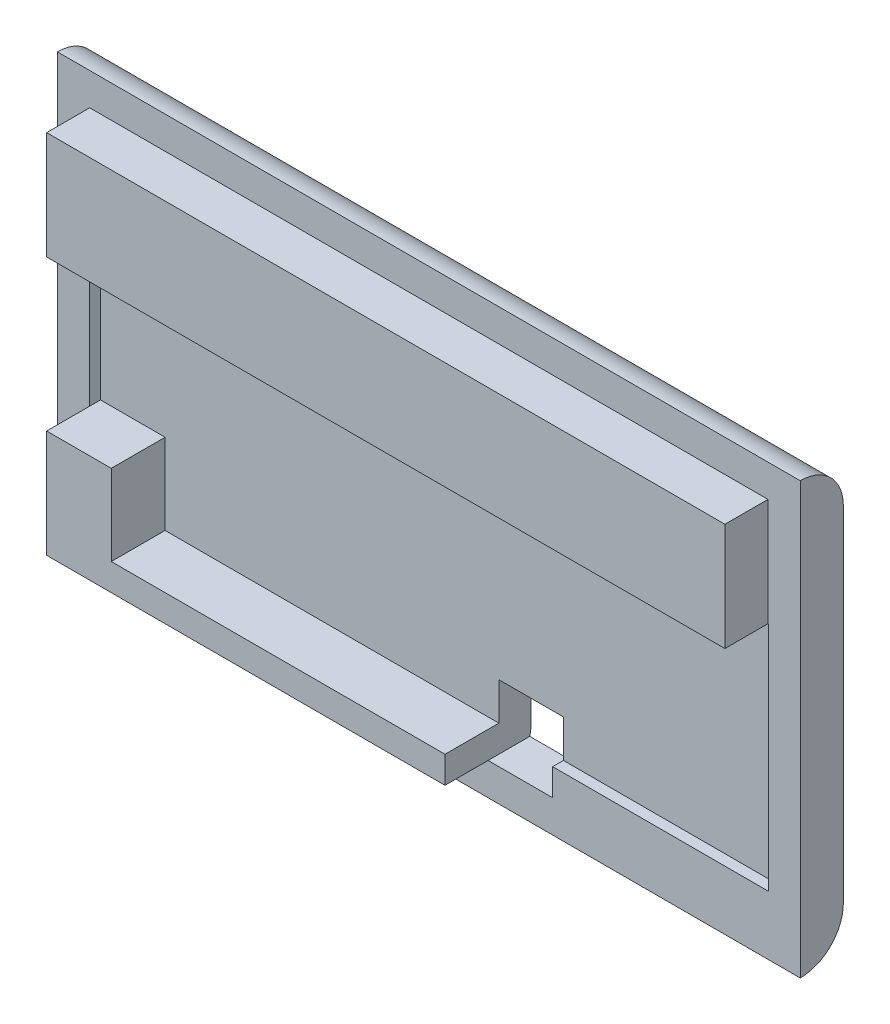
ISO-10303-21;
HEADER;
FILE_DESCRIPTION(('STEP AP214'),'2;1');
FILE_NAME('part.step','',(''),(''),'','','');
FILE_SCHEMA(('AUTOMOTIVE_DESIGN { 1 0 10303 214 1 1 1 1 }'));
ENDSEC;
DATA;
#1=APPLICATION_CONTEXT('core data for automotive mechanical design processes');
#2=APPLICATION_PROTOCOL_DEFINITION('international standard','automotive_design',2000,#1);
#3=PRODUCT_CONTEXT('',#1,'mechanical');
#4=PRODUCT('Part','Part','',(#3));
#5=PRODUCT_RELATED_PRODUCT_CATEGORY('part','',(#4));
#6=PRODUCT_DEFINITION_FORMATION('','',#4);
#7=PRODUCT_DEFINITION_CONTEXT('part definition',#1,'design');
#8=PRODUCT_DEFINITION('design','',#6,#7);
#9=PRODUCT_DEFINITION_SHAPE('','',#8);
#10=(LENGTH_UNIT() NAMED_UNIT(*) SI_UNIT(.MILLI.,.METRE.));
#11=(NAMED_UNIT(*) PLANE_ANGLE_UNIT() SI_UNIT($,.RADIAN.));
#12=(NAMED_UNIT(*) SI_UNIT($,.STERADIAN.) SOLID_ANGLE_UNIT());
#13=UNCERTAINTY_MEASURE_WITH_UNIT(LENGTH_MEASURE(1.E-05),#10,'distance_accuracy_value','');
#14=(GEOMETRIC_REPRESENTATION_CONTEXT(3) GLOBAL_UNCERTAINTY_ASSIGNED_CONTEXT((#13)) GLOBAL_UNIT_ASSIGNED_CONTEXT((#10,
#11,#12)) REPRESENTATION_CONTEXT('',''));
#15=CARTESIAN_POINT('',(0.,0.,0.));
#16=DIRECTION('',(0.,0.,1.));
#17=DIRECTION('',(1.,0.,0.));
#18=AXIS2_PLACEMENT_3D('',#15,#16,#17);
#19=CARTESIAN_POINT('',(5.75,-5.5,10.));
#20=DIRECTION('',(0.,1.,0.));
#21=DIRECTION('',(0.,0.,1.));
#22=AXIS2_PLACEMENT_3D('',#19,#20,#21);
#23=PLANE('',#22);
#24=DIRECTION('',(1.,0.,0.));
#25=VECTOR('',#24,1.);
#26=CARTESIAN_POINT('',(5.75,-5.5,1.5));
#27=LINE('',#26,#25);
#28=CARTESIAN_POINT('',(2.75,-5.5,1.5));
#29=VERTEX_POINT('',#28);
#30=CARTESIAN_POINT('',(5.75,-5.5,1.5));
#31=VERTEX_POINT('',#30);
#32=EDGE_CURVE('E248',#29,#31,#27,.T.);
#33=ORIENTED_EDGE('',*,*,#32,.F.);
#34=DIRECTION('',(0.,0.,-1.));
#35=VECTOR('',#34,1.);
#36=CARTESIAN_POINT('',(2.75,-5.5,10.));
#37=LINE('',#36,#35);
#38=CARTESIAN_POINT('',(2.75,-5.5,0.));
#39=VERTEX_POINT('',#38);
#40=EDGE_CURVE('E296',#29,#39,#37,.T.);
#41=ORIENTED_EDGE('',*,*,#40,.T.);
#42=DIRECTION('',(1.,0.,0.));
#43=VECTOR('',#42,1.);
#44=CARTESIAN_POINT('',(5.75,-5.5,0.));
#45=LINE('',#44,#43);
#46=CARTESIAN_POINT('',(5.75,-5.5,0.));
#47=VERTEX_POINT('',#46);
#48=EDGE_CURVE('E289',#39,#47,#45,.T.);
#49=ORIENTED_EDGE('',*,*,#48,.T.);
#50=DIRECTION('',(0.,0.,-1.));
#51=VECTOR('',#50,1.);
#52=CARTESIAN_POINT('',(5.75,-5.5,10.));
#53=LINE('',#52,#51);
#54=EDGE_CURVE('E304',#31,#47,#53,.T.);
#55=ORIENTED_EDGE('',*,*,#54,.F.);
#56=EDGE_LOOP('',(#33,#41,#49,#55));
#57=FACE_BOUND('',#56,.T.);
#58=ADVANCED_FACE('F44',(#57),#23,.F.);
#59=CARTESIAN_POINT('',(5.75,-8.5,10.));
#60=DIRECTION('',(1.,0.,0.));
#61=DIRECTION('',(0.,1.,0.));
#62=AXIS2_PLACEMENT_3D('',#59,#60,#61);
#63=PLANE('',#62);
#64=DIRECTION('',(0.,-1.,0.));
#65=VECTOR('',#64,1.);
#66=CARTESIAN_POINT('',(5.75,-8.5,2.));
#67=LINE('',#66,#65);
#68=CARTESIAN_POINT('',(5.75,-7.25,2.));
#69=VERTEX_POINT('',#68);
#70=CARTESIAN_POINT('',(5.75,-8.5,2.));
#71=VERTEX_POINT('',#70);
#72=EDGE_CURVE('E278',#69,#71,#67,.T.);
#73=ORIENTED_EDGE('',*,*,#72,.F.);
#74=DIRECTION('',(0.,0.,-1.));
#75=VECTOR('',#74,1.);
#76=CARTESIAN_POINT('',(5.75,-7.25,10.));
#77=LINE('',#76,#75);
#78=CARTESIAN_POINT('',(5.74999999999999,-7.25,1.5));
#79=VERTEX_POINT('',#78);
#80=EDGE_CURVE('E268',#69,#79,#77,.T.);
#81=ORIENTED_EDGE('',*,*,#80,.T.);
#82=DIRECTION('',(0.,-1.,0.));
#83=VECTOR('',#82,1.);
#84=CARTESIAN_POINT('',(5.75,-8.5,1.5));
#85=LINE('',#84,#83);
#86=EDGE_CURVE('E262',#31,#79,#85,.T.);
#87=ORIENTED_EDGE('',*,*,#86,.F.);
#88=ORIENTED_EDGE('',*,*,#54,.T.);
#89=DIRECTION('',(0.,-1.,0.));
#90=VECTOR('',#89,1.);
#91=CARTESIAN_POINT('',(5.75,-8.5,0.));
#92=LINE('',#91,#90);
#93=CARTESIAN_POINT('',(5.75,-8.,0.));
#94=VERTEX_POINT('',#93);
#95=EDGE_CURVE('E293',#47,#94,#92,.T.);
#96=ORIENTED_EDGE('',*,*,#95,.T.);
#97=CARTESIAN_POINT('',(5.75,-8.,2.));
#98=DIRECTION('',(1.,0.,0.));
#99=DIRECTION('',(0.,1.,0.));
#100=AXIS2_PLACEMENT_3D('',#97,#98,#99);
#101=CIRCLE('',#100,2.);
#102=CARTESIAN_POINT('',(5.75,-8.5,0.0635083268962899));
#103=VERTEX_POINT('',#102);
#104=EDGE_CURVE('E68',#94,#103,#101,.F.);
#105=ORIENTED_EDGE('',*,*,#104,.T.);
#106=DIRECTION('',(0.,0.,-1.));
#107=VECTOR('',#106,1.);
#108=CARTESIAN_POINT('',(5.75,-8.5,10.));
#109=LINE('',#108,#107);
#110=EDGE_CURVE('E301',#71,#103,#109,.T.);
#111=ORIENTED_EDGE('',*,*,#110,.F.);
#112=EDGE_LOOP('',(#73,#81,#87,#88,#96,#105,#111));
#113=FACE_BOUND('',#112,.T.);
#114=ADVANCED_FACE('F510',(#113),#63,.F.);
#115=CARTESIAN_POINT('',(-15.75,-8.5,4.));
#116=DIRECTION('',(0.,1.,0.));
#117=DIRECTION('',(0.,0.,1.));
#118=AXIS2_PLACEMENT_3D('',#115,#116,#117);
#119=PLANE('',#118);
#120=DIRECTION('',(1.,0.,0.));
#121=VECTOR('',#120,1.);
#122=CARTESIAN_POINT('',(-15.75,-8.5,2.));
#123=LINE('',#122,#121);
#124=CARTESIAN_POINT('',(-15.75,-8.5,2.));
#125=VERTEX_POINT('',#124);
#126=CARTESIAN_POINT('',(2.75,-8.5,2.));
#127=VERTEX_POINT('',#126);
#128=EDGE_CURVE('E361',#125,#127,#123,.T.);
#129=ORIENTED_EDGE('',*,*,#128,.T.);
#130=DIRECTION('',(0.,0.,-1.));
#131=VECTOR('',#130,1.);
#132=CARTESIAN_POINT('',(2.75,-8.5,10.));
#133=LINE('',#132,#131);
#134=CARTESIAN_POINT('',(2.75,-8.5,4.));
#135=VERTEX_POINT('',#134);
#136=EDGE_CURVE('E300',#135,#127,#133,.T.);
#137=ORIENTED_EDGE('',*,*,#136,.F.);
#138=DIRECTION('',(1.,0.,0.));
#139=VECTOR('',#138,1.);
#140=CARTESIAN_POINT('',(-15.75,-8.5,4.));
#141=LINE('',#140,#139);
#142=CARTESIAN_POINT('',(-15.75,-8.5,4.));
#143=VERTEX_POINT('',#142);
#144=EDGE_CURVE('E360',#143,#135,#141,.T.);
#145=ORIENTED_EDGE('',*,*,#144,.F.);
#146=DIRECTION('',(0.,0.,-1.));
#147=VECTOR('',#146,1.);
#148=CARTESIAN_POINT('',(-15.75,-8.5,4.));
#149=LINE('',#148,#147);
#150=EDGE_CURVE('E357',#143,#125,#149,.T.);
#151=ORIENTED_EDGE('',*,*,#150,.T.);
#152=EDGE_LOOP('',(#129,#137,#145,#151));
#153=FACE_BOUND('',#152,.T.);
#154=ADVANCED_FACE('F452',(#153),#119,.F.);
#155=CARTESIAN_POINT('',(0.,0.,2.));
#156=DIRECTION('',(0.,0.,1.));
#157=DIRECTION('',(1.,0.,0.));
#158=AXIS2_PLACEMENT_3D('',#155,#156,#157);
#159=PLANE('',#158);
#160=DIRECTION('',(0.,-1.,0.));
#161=VECTOR('',#160,1.);
#162=CARTESIAN_POINT('',(-15.75,0.,2.));
#163=LINE('',#162,#161);
#164=CARTESIAN_POINT('',(-15.75,3.5,2.));
#165=VERTEX_POINT('',#164);
#166=CARTESIAN_POINT('',(-15.75,-3.5,2.));
#167=VERTEX_POINT('',#166);
#168=EDGE_CURVE('E205',#165,#167,#163,.T.);
#169=ORIENTED_EDGE('',*,*,#168,.F.);
#170=DIRECTION('',(0.,-1.,0.));
#171=VECTOR('',#170,1.);
#172=CARTESIAN_POINT('',(-15.75,8.5,2.));
#173=LINE('',#172,#171);
#174=CARTESIAN_POINT('',(-15.75,8.5,2.));
#175=VERTEX_POINT('',#174);
#176=EDGE_CURVE('E333',#175,#165,#173,.T.);
#177=ORIENTED_EDGE('',*,*,#176,.F.);
#178=DIRECTION('',(-1.,0.,0.));
#179=VECTOR('',#178,1.);
#180=CARTESIAN_POINT('',(-15.75,8.5,2.));
#181=LINE('',#180,#179);
#182=CARTESIAN_POINT('',(15.75,8.5,2.));
#183=VERTEX_POINT('',#182);
#184=EDGE_CURVE('E329',#183,#175,#181,.T.);
#185=ORIENTED_EDGE('',*,*,#184,.F.);
#186=DIRECTION('',(0.,1.,0.));
#187=VECTOR('',#186,1.);
#188=CARTESIAN_POINT('',(15.75,8.5,2.));
#189=LINE('',#188,#187);
#190=CARTESIAN_POINT('',(15.75,3.5,2.));
#191=VERTEX_POINT('',#190);
#192=EDGE_CURVE('E319',#191,#183,#189,.T.);
#193=ORIENTED_EDGE('',*,*,#192,.F.);
#194=DIRECTION('',(-1.,0.,0.));
#195=VECTOR('',#194,1.);
#196=CARTESIAN_POINT('',(0.,3.5,2.));
#197=LINE('',#196,#195);
#198=CARTESIAN_POINT('',(15.7628865621832,3.5,2.));
#199=VERTEX_POINT('',#198);
#200=EDGE_CURVE('E272',#199,#191,#197,.T.);
#201=ORIENTED_EDGE('',*,*,#200,.F.);
#202=DIRECTION('',(0.,1.,0.));
#203=VECTOR('',#202,1.);
#204=CARTESIAN_POINT('',(15.7628865621832,0.,2.));
#205=LINE('',#204,#203);
#206=CARTESIAN_POINT('',(15.7628865621832,-7.25,2.));
#207=VERTEX_POINT('',#206);
#208=EDGE_CURVE('E11',#207,#199,#205,.T.);
#209=ORIENTED_EDGE('',*,*,#208,.F.);
#210=DIRECTION('',(1.,0.,0.));
#211=VECTOR('',#210,1.);
#212=CARTESIAN_POINT('',(0.,-7.25,2.));
#213=LINE('',#212,#211);
#214=EDGE_CURVE('E265',#69,#207,#213,.T.);
#215=ORIENTED_EDGE('',*,*,#214,.F.);
#216=ORIENTED_EDGE('',*,*,#72,.T.);
#217=DIRECTION('',(1.,0.,0.));
#218=VECTOR('',#217,1.);
#219=CARTESIAN_POINT('',(0.,-8.5,2.));
#220=LINE('',#219,#218);
#221=EDGE_CURVE('E309',#127,#71,#220,.T.);
#222=ORIENTED_EDGE('',*,*,#221,.F.);
#223=ORIENTED_EDGE('',*,*,#128,.F.);
#224=DIRECTION('',(0.,-1.,0.));
#225=VECTOR('',#224,1.);
#226=CARTESIAN_POINT('',(-15.75,-8.5,2.));
#227=LINE('',#226,#225);
#228=EDGE_CURVE('E334',#167,#125,#227,.T.);
#229=ORIENTED_EDGE('',*,*,#228,.F.);
#230=EDGE_LOOP('',(#169,#177,#185,#193,#201,#209,#215,#216,#222,#223,#229));
#231=FACE_BOUND('',#230,.T.);
#232=DIRECTION('',(0.,1.,0.));
#233=VECTOR('',#232,1.);
#234=CARTESIAN_POINT('',(17.25,10.,2.));
#235=LINE('',#234,#233);
#236=CARTESIAN_POINT('',(17.25,-10.,2.));
#237=VERTEX_POINT('',#236);
#238=CARTESIAN_POINT('',(17.25,10.,2.));
#239=VERTEX_POINT('',#238);
#240=EDGE_CURVE('E377',#237,#239,#235,.T.);
#241=ORIENTED_EDGE('',*,*,#240,.T.);
#242=DIRECTION('',(-1.,0.,0.));
#243=VECTOR('',#242,1.);
#244=CARTESIAN_POINT('',(-17.25,10.,2.));
#245=LINE('',#244,#243);
#246=CARTESIAN_POINT('',(-17.25,10.,2.));
#247=VERTEX_POINT('',#246);
#248=EDGE_CURVE('E381',#239,#247,#245,.T.);
#249=ORIENTED_EDGE('',*,*,#248,.T.);
#250=DIRECTION('',(0.,-1.,0.));
#251=VECTOR('',#250,1.);
#252=CARTESIAN_POINT('',(-17.25,10.,2.));
#253=LINE('',#252,#251);
#254=CARTESIAN_POINT('',(-17.25,-10.,2.));
#255=VERTEX_POINT('',#254);
#256=EDGE_CURVE('E386',#247,#255,#253,.T.);
#257=ORIENTED_EDGE('',*,*,#256,.T.);
#258=DIRECTION('',(1.,0.,0.));
#259=VECTOR('',#258,1.);
#260=CARTESIAN_POINT('',(-17.25,-10.,2.));
#261=LINE('',#260,#259);
#262=EDGE_CURVE('E390',#255,#237,#261,.T.);
#263=ORIENTED_EDGE('',*,*,#262,.T.);
#264=EDGE_LOOP('',(#241,#249,#257,#263));
#265=FACE_BOUND('',#264,.T.);
#266=ADVANCED_FACE('F473',(#231,#265),#159,.T.);
#267=CARTESIAN_POINT('',(17.25,10.,2.));
#268=DIRECTION('',(-1.,0.,0.));
#269=DIRECTION('',(0.,0.,1.));
#270=AXIS2_PLACEMENT_3D('',#267,#268,#269);
#271=PLANE('',#270);
#272=ORIENTED_EDGE('',*,*,#240,.F.);
#273=CARTESIAN_POINT('',(17.25,-8.,2.));
#274=DIRECTION('',(-1.,0.,0.));
#275=DIRECTION('',(0.,0.,1.));
#276=AXIS2_PLACEMENT_3D('',#273,#274,#275);
#277=CIRCLE('',#276,2.);
#278=CARTESIAN_POINT('',(17.25,-8.00000000000001,0.));
#279=VERTEX_POINT('',#278);
#280=EDGE_CURVE('E407',#237,#279,#277,.F.);
#281=ORIENTED_EDGE('',*,*,#280,.T.);
#282=DIRECTION('',(0.,1.,0.));
#283=VECTOR('',#282,1.);
#284=CARTESIAN_POINT('',(17.25,10.,0.));
#285=LINE('',#284,#283);
#286=CARTESIAN_POINT('',(17.25,8.,0.));
#287=VERTEX_POINT('',#286);
#288=EDGE_CURVE('E354',#279,#287,#285,.T.);
#289=ORIENTED_EDGE('',*,*,#288,.T.);
#290=CARTESIAN_POINT('',(17.25,8.,2.));
#291=DIRECTION('',(-1.,0.,0.));
#292=DIRECTION('',(0.,0.,1.));
#293=AXIS2_PLACEMENT_3D('',#290,#291,#292);
#294=CIRCLE('',#293,2.);
#295=EDGE_CURVE('E404',#287,#239,#294,.F.);
#296=ORIENTED_EDGE('',*,*,#295,.T.);
#297=EDGE_LOOP('',(#272,#281,#289,#296));
#298=FACE_BOUND('',#297,.T.);
#299=ADVANCED_FACE('F525',(#298),#271,.F.);
#300=CARTESIAN_POINT('',(-17.25,10.,2.));
#301=DIRECTION('',(1.,0.,0.));
#302=DIRECTION('',(0.,0.,-1.));
#303=AXIS2_PLACEMENT_3D('',#300,#301,#302);
#304=PLANE('',#303);
#305=DIRECTION('',(0.,-1.,0.));
#306=VECTOR('',#305,1.);
#307=CARTESIAN_POINT('',(-17.25,10.,0.));
#308=LINE('',#307,#306);
#309=CARTESIAN_POINT('',(-17.25,8.,0.));
#310=VERTEX_POINT('',#309);
#311=CARTESIAN_POINT('',(-17.25,-8.00000000000001,0.));
#312=VERTEX_POINT('',#311);
#313=EDGE_CURVE('E382',#310,#312,#308,.T.);
#314=ORIENTED_EDGE('',*,*,#313,.T.);
#315=CARTESIAN_POINT('',(-17.25,-8.,2.));
#316=DIRECTION('',(1.,0.,0.));
#317=DIRECTION('',(0.,0.,-1.));
#318=AXIS2_PLACEMENT_3D('',#315,#316,#317);
#319=CIRCLE('',#318,2.);
#320=EDGE_CURVE('E429',#312,#255,#319,.F.);
#321=ORIENTED_EDGE('',*,*,#320,.T.);
#322=ORIENTED_EDGE('',*,*,#256,.F.);
#323=CARTESIAN_POINT('',(-17.25,8.,2.));
#324=DIRECTION('',(1.,0.,0.));
#325=DIRECTION('',(0.,0.,-1.));
#326=AXIS2_PLACEMENT_3D('',#323,#324,#325);
#327=CIRCLE('',#326,2.);
#328=EDGE_CURVE('E426',#247,#310,#327,.F.);
#329=ORIENTED_EDGE('',*,*,#328,.T.);
#330=EDGE_LOOP('',(#314,#321,#322,#329));
#331=FACE_BOUND('',#330,.T.);
#332=ADVANCED_FACE('F518',(#331),#304,.F.);
#333=CARTESIAN_POINT('',(0.,0.,0.));
#334=DIRECTION('',(0.,0.,1.));
#335=DIRECTION('',(1.,0.,0.));
#336=AXIS2_PLACEMENT_3D('',#333,#334,#335);
#337=PLANE('',#336);
#338=ORIENTED_EDGE('',*,*,#288,.F.);
#339=DIRECTION('',(1.,0.,0.));
#340=VECTOR('',#339,1.);
#341=CARTESIAN_POINT('',(0.,-8.,0.));
#342=LINE('',#341,#340);
#343=EDGE_CURVE('E416',#279,#94,#342,.F.);
#344=ORIENTED_EDGE('',*,*,#343,.T.);
#345=ORIENTED_EDGE('',*,*,#95,.F.);
#346=ORIENTED_EDGE('',*,*,#48,.F.);
#347=DIRECTION('',(0.,1.,0.));
#348=VECTOR('',#347,1.);
#349=CARTESIAN_POINT('',(2.75,-8.5,0.));
#350=LINE('',#349,#348);
#351=CARTESIAN_POINT('',(2.75,-8.,0.));
#352=VERTEX_POINT('',#351);
#353=EDGE_CURVE('E285',#352,#39,#350,.T.);
#354=ORIENTED_EDGE('',*,*,#353,.F.);
#355=DIRECTION('',(1.,0.,0.));
#356=VECTOR('',#355,1.);
#357=CARTESIAN_POINT('',(0.,-8.,0.));
#358=LINE('',#357,#356);
#359=EDGE_CURVE('E413',#352,#312,#358,.F.);
#360=ORIENTED_EDGE('',*,*,#359,.T.);
#361=ORIENTED_EDGE('',*,*,#313,.F.);
#362=DIRECTION('',(-1.,0.,0.));
#363=VECTOR('',#362,1.);
#364=CARTESIAN_POINT('',(0.,8.,0.));
#365=LINE('',#364,#363);
#366=EDGE_CURVE('E410',#310,#287,#365,.F.);
#367=ORIENTED_EDGE('',*,*,#366,.T.);
#368=EDGE_LOOP('',(#338,#344,#345,#346,#354,#360,#361,#367));
#369=FACE_BOUND('',#368,.T.);
#370=ADVANCED_FACE('F507',(#369),#337,.F.);
#371=CARTESIAN_POINT('',(-15.75,-3.5,4.));
#372=DIRECTION('',(0.,-1.,0.));
#373=DIRECTION('',(0.,0.,-1.));
#374=AXIS2_PLACEMENT_3D('',#371,#372,#373);
#375=PLANE('',#374);
#376=DIRECTION('',(-1.,0.,0.));
#377=VECTOR('',#376,1.);
#378=CARTESIAN_POINT('',(-15.75,-3.5,4.));
#379=LINE('',#378,#377);
#380=CARTESIAN_POINT('',(-12.75,-3.5,4.));
#381=VERTEX_POINT('',#380);
#382=CARTESIAN_POINT('',(-15.75,-3.5,4.));
#383=VERTEX_POINT('',#382);
#384=EDGE_CURVE('E365',#381,#383,#379,.T.);
#385=ORIENTED_EDGE('',*,*,#384,.F.);
#386=DIRECTION('',(0.,0.,1.));
#387=VECTOR('',#386,1.);
#388=CARTESIAN_POINT('',(-12.75,-3.5,2.));
#389=LINE('',#388,#387);
#390=CARTESIAN_POINT('',(-12.75,-3.5,1.5));
#391=VERTEX_POINT('',#390);
#392=EDGE_CURVE('E217',#391,#381,#389,.T.);
#393=ORIENTED_EDGE('',*,*,#392,.F.);
#394=DIRECTION('',(1.,0.,0.));
#395=VECTOR('',#394,1.);
#396=CARTESIAN_POINT('',(-15.75,-3.5,1.5));
#397=LINE('',#396,#395);
#398=CARTESIAN_POINT('',(-15.75,-3.5,1.5));
#399=VERTEX_POINT('',#398);
#400=EDGE_CURVE('E214',#399,#391,#397,.T.);
#401=ORIENTED_EDGE('',*,*,#400,.F.);
#402=DIRECTION('',(0.,0.,1.));
#403=VECTOR('',#402,1.);
#404=CARTESIAN_POINT('',(-15.75,-3.5,1.5));
#405=LINE('',#404,#403);
#406=EDGE_CURVE('E198',#399,#167,#405,.T.);
#407=ORIENTED_EDGE('',*,*,#406,.T.);
#408=DIRECTION('',(0.,0.,-1.));
#409=VECTOR('',#408,1.);
#410=CARTESIAN_POINT('',(-15.75,-3.5,4.));
#411=LINE('',#410,#409);
#412=EDGE_CURVE('E313',#383,#167,#411,.T.);
#413=ORIENTED_EDGE('',*,*,#412,.F.);
#414=EDGE_LOOP('',(#385,#393,#401,#407,#413));
#415=FACE_BOUND('',#414,.T.);
#416=ADVANCED_FACE('F216',(#415),#375,.F.);
#417=CARTESIAN_POINT('',(-15.75,-8.5,4.));
#418=DIRECTION('',(1.,0.,0.));
#419=DIRECTION('',(0.,1.,0.));
#420=AXIS2_PLACEMENT_3D('',#417,#418,#419);
#421=PLANE('',#420);
#422=ORIENTED_EDGE('',*,*,#228,.T.);
#423=ORIENTED_EDGE('',*,*,#150,.F.);
#424=DIRECTION('',(0.,-1.,0.));
#425=VECTOR('',#424,1.);
#426=CARTESIAN_POINT('',(-15.75,-8.5,4.));
#427=LINE('',#426,#425);
#428=EDGE_CURVE('E372',#383,#143,#427,.T.);
#429=ORIENTED_EDGE('',*,*,#428,.F.);
#430=ORIENTED_EDGE('',*,*,#412,.T.);
#431=EDGE_LOOP('',(#422,#423,#429,#430));
#432=FACE_BOUND('',#431,.T.);
#433=ADVANCED_FACE('F493',(#432),#421,.F.);
#434=CARTESIAN_POINT('',(0.,0.,4.));
#435=DIRECTION('',(0.,0.,-1.));
#436=DIRECTION('',(-1.,0.,0.));
#437=AXIS2_PLACEMENT_3D('',#434,#435,#436);
#438=PLANE('',#437);
#439=DIRECTION('',(0.,1.,0.));
#440=VECTOR('',#439,1.);
#441=CARTESIAN_POINT('',(2.75,0.,4.));
#442=LINE('',#441,#440);
#443=CARTESIAN_POINT('',(2.75,-7.25,4.));
#444=VERTEX_POINT('',#443);
#445=EDGE_CURVE('E394',#135,#444,#442,.T.);
#446=ORIENTED_EDGE('',*,*,#445,.T.);
#447=DIRECTION('',(1.,0.,0.));
#448=VECTOR('',#447,1.);
#449=CARTESIAN_POINT('',(-12.75,-7.25,4.));
#450=LINE('',#449,#448);
#451=CARTESIAN_POINT('',(-12.75,-7.25,4.));
#452=VERTEX_POINT('',#451);
#453=EDGE_CURVE('E228',#452,#444,#450,.T.);
#454=ORIENTED_EDGE('',*,*,#453,.F.);
#455=DIRECTION('',(0.,-1.,0.));
#456=VECTOR('',#455,1.);
#457=CARTESIAN_POINT('',(-12.75,-3.5,4.));
#458=LINE('',#457,#456);
#459=EDGE_CURVE('E277',#381,#452,#458,.T.);
#460=ORIENTED_EDGE('',*,*,#459,.F.);
#461=ORIENTED_EDGE('',*,*,#384,.T.);
#462=ORIENTED_EDGE('',*,*,#428,.T.);
#463=ORIENTED_EDGE('',*,*,#144,.T.);
#464=EDGE_LOOP('',(#446,#454,#460,#461,#462,#463));
#465=FACE_BOUND('',#464,.T.);
#466=ADVANCED_FACE('F446',(#465),#438,.F.);
#467=CARTESIAN_POINT('',(-15.75,8.5,4.));
#468=DIRECTION('',(0.,-1.,0.));
#469=DIRECTION('',(0.,0.,-1.));
#470=AXIS2_PLACEMENT_3D('',#467,#468,#469);
#471=PLANE('',#470);
#472=ORIENTED_EDGE('',*,*,#184,.T.);
#473=DIRECTION('',(0.,0.,-1.));
#474=VECTOR('',#473,1.);
#475=CARTESIAN_POINT('',(-15.75,8.5,4.));
#476=LINE('',#475,#474);
#477=CARTESIAN_POINT('',(-15.75,8.5,4.));
#478=VERTEX_POINT('',#477);
#479=EDGE_CURVE('E351',#478,#175,#476,.T.);
#480=ORIENTED_EDGE('',*,*,#479,.F.);
#481=DIRECTION('',(-1.,0.,0.));
#482=VECTOR('',#481,1.);
#483=CARTESIAN_POINT('',(-15.75,8.5,4.));
#484=LINE('',#483,#482);
#485=CARTESIAN_POINT('',(15.75,8.5,4.));
#486=VERTEX_POINT('',#485);
#487=EDGE_CURVE('E314',#486,#478,#484,.T.);
#488=ORIENTED_EDGE('',*,*,#487,.F.);
#489=DIRECTION('',(0.,0.,-1.));
#490=VECTOR('',#489,1.);
#491=CARTESIAN_POINT('',(15.75,8.5,4.));
#492=LINE('',#491,#490);
#493=EDGE_CURVE('E328',#486,#183,#492,.T.);
#494=ORIENTED_EDGE('',*,*,#493,.T.);
#495=EDGE_LOOP('',(#472,#480,#488,#494));
#496=FACE_BOUND('',#495,.T.);
#497=ADVANCED_FACE('F483',(#496),#471,.F.);
#498=CARTESIAN_POINT('',(-15.75,8.5,4.));
#499=DIRECTION('',(1.,0.,0.));
#500=DIRECTION('',(0.,0.,-1.));
#501=AXIS2_PLACEMENT_3D('',#498,#499,#500);
#502=PLANE('',#501);
#503=ORIENTED_EDGE('',*,*,#176,.T.);
#504=DIRECTION('',(0.,0.,-1.));
#505=VECTOR('',#504,1.);
#506=CARTESIAN_POINT('',(-15.75,3.5,4.));
#507=LINE('',#506,#505);
#508=CARTESIAN_POINT('',(-15.75,3.5,4.));
#509=VERTEX_POINT('',#508);
#510=EDGE_CURVE('E347',#509,#165,#507,.T.);
#511=ORIENTED_EDGE('',*,*,#510,.F.);
#512=DIRECTION('',(0.,-1.,0.));
#513=VECTOR('',#512,1.);
#514=CARTESIAN_POINT('',(-15.75,8.5,4.));
#515=LINE('',#514,#513);
#516=EDGE_CURVE('E318',#478,#509,#515,.T.);
#517=ORIENTED_EDGE('',*,*,#516,.F.);
#518=ORIENTED_EDGE('',*,*,#479,.T.);
#519=EDGE_LOOP('',(#503,#511,#517,#518));
#520=FACE_BOUND('',#519,.T.);
#521=ADVANCED_FACE('F490',(#520),#502,.F.);
#522=CARTESIAN_POINT('',(-15.75,3.5,4.));
#523=DIRECTION('',(0.,1.,0.));
#524=DIRECTION('',(0.,0.,1.));
#525=AXIS2_PLACEMENT_3D('',#522,#523,#524);
#526=PLANE('',#525);
#527=ORIENTED_EDGE('',*,*,#510,.T.);
#528=DIRECTION('',(0.,0.,1.));
#529=VECTOR('',#528,1.);
#530=CARTESIAN_POINT('',(-15.75,3.5,1.5));
#531=LINE('',#530,#529);
#532=CARTESIAN_POINT('',(-15.75,3.5,1.5));
#533=VERTEX_POINT('',#532);
#534=EDGE_CURVE('E245',#533,#165,#531,.T.);
#535=ORIENTED_EDGE('',*,*,#534,.F.);
#536=DIRECTION('',(-1.,0.,0.));
#537=VECTOR('',#536,1.);
#538=CARTESIAN_POINT('',(-15.75,3.5,1.5));
#539=LINE('',#538,#537);
#540=CARTESIAN_POINT('',(15.7628865621832,3.5,1.5));
#541=VERTEX_POINT('',#540);
#542=EDGE_CURVE('E211',#541,#533,#539,.T.);
#543=ORIENTED_EDGE('',*,*,#542,.F.);
#544=DIRECTION('',(0.,0.,1.));
#545=VECTOR('',#544,1.);
#546=CARTESIAN_POINT('',(15.7628865621832,3.5,1.5));
#547=LINE('',#546,#545);
#548=EDGE_CURVE('E249',#541,#199,#547,.T.);
#549=ORIENTED_EDGE('',*,*,#548,.T.);
#550=ORIENTED_EDGE('',*,*,#200,.T.);
#551=DIRECTION('',(0.,0.,-1.));
#552=VECTOR('',#551,1.);
#553=CARTESIAN_POINT('',(15.75,3.5,4.));
#554=LINE('',#553,#552);
#555=CARTESIAN_POINT('',(15.75,3.5,4.));
#556=VERTEX_POINT('',#555);
#557=EDGE_CURVE('E343',#556,#191,#554,.T.);
#558=ORIENTED_EDGE('',*,*,#557,.F.);
#559=DIRECTION('',(1.,0.,0.));
#560=VECTOR('',#559,1.);
#561=CARTESIAN_POINT('',(-15.75,3.5,4.));
#562=LINE('',#561,#560);
#563=EDGE_CURVE('E322',#509,#556,#562,.T.);
#564=ORIENTED_EDGE('',*,*,#563,.F.);
#565=EDGE_LOOP('',(#527,#535,#543,#549,#550,#558,#564));
#566=FACE_BOUND('',#565,.T.);
#567=ADVANCED_FACE('F469',(#566),#526,.F.);
#568=CARTESIAN_POINT('',(15.75,8.5,4.));
#569=DIRECTION('',(-1.,0.,0.));
#570=DIRECTION('',(0.,0.,1.));
#571=AXIS2_PLACEMENT_3D('',#568,#569,#570);
#572=PLANE('',#571);
#573=ORIENTED_EDGE('',*,*,#192,.T.);
#574=ORIENTED_EDGE('',*,*,#493,.F.);
#575=DIRECTION('',(0.,1.,0.));
#576=VECTOR('',#575,1.);
#577=CARTESIAN_POINT('',(15.75,8.5,4.));
#578=LINE('',#577,#576);
#579=EDGE_CURVE('E325',#556,#486,#578,.T.);
#580=ORIENTED_EDGE('',*,*,#579,.F.);
#581=ORIENTED_EDGE('',*,*,#557,.T.);
#582=EDGE_LOOP('',(#573,#574,#580,#581));
#583=FACE_BOUND('',#582,.T.);
#584=ADVANCED_FACE('F479',(#583),#572,.F.);
#585=CARTESIAN_POINT('',(0.,0.,4.));
#586=DIRECTION('',(0.,0.,-1.));
#587=DIRECTION('',(-1.,0.,0.));
#588=AXIS2_PLACEMENT_3D('',#585,#586,#587);
#589=PLANE('',#588);
#590=ORIENTED_EDGE('',*,*,#487,.T.);
#591=ORIENTED_EDGE('',*,*,#516,.T.);
#592=ORIENTED_EDGE('',*,*,#563,.T.);
#593=ORIENTED_EDGE('',*,*,#579,.T.);
#594=EDGE_LOOP('',(#590,#591,#592,#593));
#595=FACE_BOUND('',#594,.T.);
#596=ADVANCED_FACE('F486',(#595),#589,.F.);
#597=CARTESIAN_POINT('',(2.75,-8.5,10.));
#598=DIRECTION('',(-1.,0.,0.));
#599=DIRECTION('',(0.,-1.,0.));
#600=AXIS2_PLACEMENT_3D('',#597,#598,#599);
#601=PLANE('',#600);
#602=DIRECTION('',(0.,1.,0.));
#603=VECTOR('',#602,1.);
#604=CARTESIAN_POINT('',(2.75,-8.5,1.5));
#605=LINE('',#604,#603);
#606=CARTESIAN_POINT('',(2.75,-7.25,1.5));
#607=VERTEX_POINT('',#606);
#608=EDGE_CURVE('E432',#607,#29,#605,.T.);
#609=ORIENTED_EDGE('',*,*,#608,.F.);
#610=DIRECTION('',(0.,0.,1.));
#611=VECTOR('',#610,1.);
#612=CARTESIAN_POINT('',(2.75,-7.25,10.));
#613=LINE('',#612,#611);
#614=EDGE_CURVE('E53',#607,#444,#613,.T.);
#615=ORIENTED_EDGE('',*,*,#614,.T.);
#616=ORIENTED_EDGE('',*,*,#445,.F.);
#617=ORIENTED_EDGE('',*,*,#136,.T.);
#618=CARTESIAN_POINT('',(2.75,-8.5,0.0635083268962899));
#619=VERTEX_POINT('',#618);
#620=EDGE_CURVE('E297',#127,#619,#133,.T.);
#621=ORIENTED_EDGE('',*,*,#620,.T.);
#622=CARTESIAN_POINT('',(2.75,-8.,2.));
#623=DIRECTION('',(-1.,0.,0.));
#624=DIRECTION('',(0.,-1.,0.));
#625=AXIS2_PLACEMENT_3D('',#622,#623,#624);
#626=CIRCLE('',#625,2.);
#627=EDGE_CURVE('E423',#619,#352,#626,.F.);
#628=ORIENTED_EDGE('',*,*,#627,.T.);
#629=ORIENTED_EDGE('',*,*,#353,.T.);
#630=ORIENTED_EDGE('',*,*,#40,.F.);
#631=EDGE_LOOP('',(#609,#615,#616,#617,#621,#628,#629,#630));
#632=FACE_BOUND('',#631,.T.);
#633=ADVANCED_FACE('F438',(#632),#601,.F.);
#634=CARTESIAN_POINT('',(2.75,-8.5,10.));
#635=DIRECTION('',(0.,-1.,0.));
#636=DIRECTION('',(0.,0.,-1.));
#637=AXIS2_PLACEMENT_3D('',#634,#635,#636);
#638=PLANE('',#637);
#639=ORIENTED_EDGE('',*,*,#110,.T.);
#640=DIRECTION('',(1.,0.,0.));
#641=VECTOR('',#640,1.);
#642=CARTESIAN_POINT('',(5.75,-8.5,0.0635083268962899));
#643=LINE('',#642,#641);
#644=EDGE_CURVE('E60',#103,#619,#643,.F.);
#645=ORIENTED_EDGE('',*,*,#644,.T.);
#646=ORIENTED_EDGE('',*,*,#620,.F.);
#647=ORIENTED_EDGE('',*,*,#221,.T.);
#648=EDGE_LOOP('',(#639,#645,#646,#647));
#649=FACE_BOUND('',#648,.T.);
#650=ADVANCED_FACE('F546',(#649),#638,.F.);
#651=CARTESIAN_POINT('',(-17.25,-8.,2.));
#652=DIRECTION('',(1.,0.,0.));
#653=DIRECTION('',(0.,0.,-1.));
#654=AXIS2_PLACEMENT_3D('',#651,#652,#653);
#655=CYLINDRICAL_SURFACE('',#654,2.);
#656=ORIENTED_EDGE('',*,*,#104,.F.);
#657=ORIENTED_EDGE('',*,*,#343,.F.);
#658=ORIENTED_EDGE('',*,*,#280,.F.);
#659=ORIENTED_EDGE('',*,*,#262,.F.);
#660=ORIENTED_EDGE('',*,*,#320,.F.);
#661=ORIENTED_EDGE('',*,*,#359,.F.);
#662=ORIENTED_EDGE('',*,*,#627,.F.);
#663=ORIENTED_EDGE('',*,*,#644,.F.);
#664=EDGE_LOOP('',(#656,#657,#658,#659,#660,#661,#662,#663));
#665=FACE_BOUND('',#664,.T.);
#666=ADVANCED_FACE('F512',(#665),#655,.T.);
#667=CARTESIAN_POINT('',(-17.25,8.,2.));
#668=DIRECTION('',(-1.,0.,0.));
#669=DIRECTION('',(0.,0.,1.));
#670=AXIS2_PLACEMENT_3D('',#667,#668,#669);
#671=CYLINDRICAL_SURFACE('',#670,2.);
#672=ORIENTED_EDGE('',*,*,#295,.F.);
#673=ORIENTED_EDGE('',*,*,#366,.F.);
#674=ORIENTED_EDGE('',*,*,#328,.F.);
#675=ORIENTED_EDGE('',*,*,#248,.F.);
#676=EDGE_LOOP('',(#672,#673,#674,#675));
#677=FACE_BOUND('',#676,.T.);
#678=ADVANCED_FACE('F46',(#677),#671,.T.);
#679=CARTESIAN_POINT('',(-12.75,-3.5,2.));
#680=DIRECTION('',(-1.,0.,0.));
#681=DIRECTION('',(0.,0.,1.));
#682=AXIS2_PLACEMENT_3D('',#679,#680,#681);
#683=PLANE('',#682);
#684=ORIENTED_EDGE('',*,*,#459,.T.);
#685=DIRECTION('',(0.,0.,1.));
#686=VECTOR('',#685,1.);
#687=CARTESIAN_POINT('',(-12.75,-7.25,1.5));
#688=LINE('',#687,#686);
#689=CARTESIAN_POINT('',(-12.75,-7.25,1.5));
#690=VERTEX_POINT('',#689);
#691=EDGE_CURVE('E210',#690,#452,#688,.T.);
#692=ORIENTED_EDGE('',*,*,#691,.F.);
#693=DIRECTION('',(0.,-1.,0.));
#694=VECTOR('',#693,1.);
#695=CARTESIAN_POINT('',(-12.75,-3.5,1.5));
#696=LINE('',#695,#694);
#697=EDGE_CURVE('E222',#391,#690,#696,.T.);
#698=ORIENTED_EDGE('',*,*,#697,.F.);
#699=ORIENTED_EDGE('',*,*,#392,.T.);
#700=EDGE_LOOP('',(#684,#692,#698,#699));
#701=FACE_BOUND('',#700,.T.);
#702=ADVANCED_FACE('F495',(#701),#683,.F.);
#703=CARTESIAN_POINT('',(-12.75,-7.25,1.5));
#704=DIRECTION('',(0.,-1.,0.));
#705=DIRECTION('',(0.,0.,-1.));
#706=AXIS2_PLACEMENT_3D('',#703,#704,#705);
#707=PLANE('',#706);
#708=ORIENTED_EDGE('',*,*,#214,.T.);
#709=DIRECTION('',(0.,0.,1.));
#710=VECTOR('',#709,1.);
#711=CARTESIAN_POINT('',(15.7628865621832,-7.25,1.5));
#712=LINE('',#711,#710);
#713=CARTESIAN_POINT('',(15.7628865621832,-7.25,1.5));
#714=VERTEX_POINT('',#713);
#715=EDGE_CURVE('E253',#714,#207,#712,.T.);
#716=ORIENTED_EDGE('',*,*,#715,.F.);
#717=DIRECTION('',(1.,0.,0.));
#718=VECTOR('',#717,1.);
#719=CARTESIAN_POINT('',(-12.75,-7.25,1.5));
#720=LINE('',#719,#718);
#721=EDGE_CURVE('E235',#79,#714,#720,.T.);
#722=ORIENTED_EDGE('',*,*,#721,.F.);
#723=ORIENTED_EDGE('',*,*,#80,.F.);
#724=EDGE_LOOP('',(#708,#716,#722,#723));
#725=FACE_BOUND('',#724,.T.);
#726=ADVANCED_FACE('F462',(#725),#707,.F.);
#727=EDGE_CURVE('E236',#690,#607,#720,.T.);
#728=ORIENTED_EDGE('',*,*,#727,.F.);
#729=ORIENTED_EDGE('',*,*,#691,.T.);
#730=ORIENTED_EDGE('',*,*,#453,.T.);
#731=ORIENTED_EDGE('',*,*,#614,.F.);
#732=EDGE_LOOP('',(#728,#729,#730,#731));
#733=FACE_BOUND('',#732,.T.);
#734=ADVANCED_FACE('F496',(#733),#707,.F.);
#735=CARTESIAN_POINT('',(0.,0.,1.5));
#736=DIRECTION('',(0.,0.,1.));
#737=DIRECTION('',(1.,0.,0.));
#738=AXIS2_PLACEMENT_3D('',#735,#736,#737);
#739=PLANE('',#738);
#740=ORIENTED_EDGE('',*,*,#86,.T.);
#741=ORIENTED_EDGE('',*,*,#721,.T.);
#742=DIRECTION('',(0.,1.,0.));
#743=VECTOR('',#742,1.);
#744=CARTESIAN_POINT('',(15.7628865621832,3.5,1.5));
#745=LINE('',#744,#743);
#746=EDGE_CURVE('E240',#714,#541,#745,.T.);
#747=ORIENTED_EDGE('',*,*,#746,.T.);
#748=ORIENTED_EDGE('',*,*,#542,.T.);
#749=DIRECTION('',(0.,-1.,0.));
#750=VECTOR('',#749,1.);
#751=CARTESIAN_POINT('',(-15.75,3.5,1.5));
#752=LINE('',#751,#750);
#753=EDGE_CURVE('E202',#533,#399,#752,.T.);
#754=ORIENTED_EDGE('',*,*,#753,.T.);
#755=ORIENTED_EDGE('',*,*,#400,.T.);
#756=ORIENTED_EDGE('',*,*,#697,.T.);
#757=ORIENTED_EDGE('',*,*,#727,.T.);
#758=ORIENTED_EDGE('',*,*,#608,.T.);
#759=ORIENTED_EDGE('',*,*,#32,.T.);
#760=EDGE_LOOP('',(#740,#741,#747,#748,#754,#755,#756,#757,#758,#759));
#761=FACE_BOUND('',#760,.T.);
#762=ADVANCED_FACE('F224',(#761),#739,.T.);
#763=CARTESIAN_POINT('',(-15.75,3.5,1.5));
#764=DIRECTION('',(-1.,0.,0.));
#765=DIRECTION('',(0.,-1.,0.));
#766=AXIS2_PLACEMENT_3D('',#763,#764,#765);
#767=PLANE('',#766);
#768=ORIENTED_EDGE('',*,*,#168,.T.);
#769=ORIENTED_EDGE('',*,*,#406,.F.);
#770=ORIENTED_EDGE('',*,*,#753,.F.);
#771=ORIENTED_EDGE('',*,*,#534,.T.);
#772=EDGE_LOOP('',(#768,#769,#770,#771));
#773=FACE_BOUND('',#772,.T.);
#774=ADVANCED_FACE('F200',(#773),#767,.F.);
#775=CARTESIAN_POINT('',(15.7628865621832,3.5,1.5));
#776=DIRECTION('',(1.,0.,0.));
#777=DIRECTION('',(0.,0.,-1.));
#778=AXIS2_PLACEMENT_3D('',#775,#776,#777);
#779=PLANE('',#778);
#780=ORIENTED_EDGE('',*,*,#208,.T.);
#781=ORIENTED_EDGE('',*,*,#548,.F.);
#782=ORIENTED_EDGE('',*,*,#746,.F.);
#783=ORIENTED_EDGE('',*,*,#715,.T.);
#784=EDGE_LOOP('',(#780,#781,#782,#783));
#785=FACE_BOUND('',#784,.T.);
#786=ADVANCED_FACE('F466',(#785),#779,.F.);
#787=CLOSED_SHELL('',(#58,#114,#154,#266,#299,#332,#370,#416,#433,#466,#497,#521,#567,#584,#596,
#633,#650,#666,#678,#702,#726,#734,#762,#774,#786));
#788=MANIFOLD_SOLID_BREP('B2',#787);
#789=ADVANCED_BREP_SHAPE_REPRESENTATION('',(#18,#788),#14);
#790=SHAPE_DEFINITION_REPRESENTATION(#9,#789);
ENDSEC;
END-ISO-10303-21;
